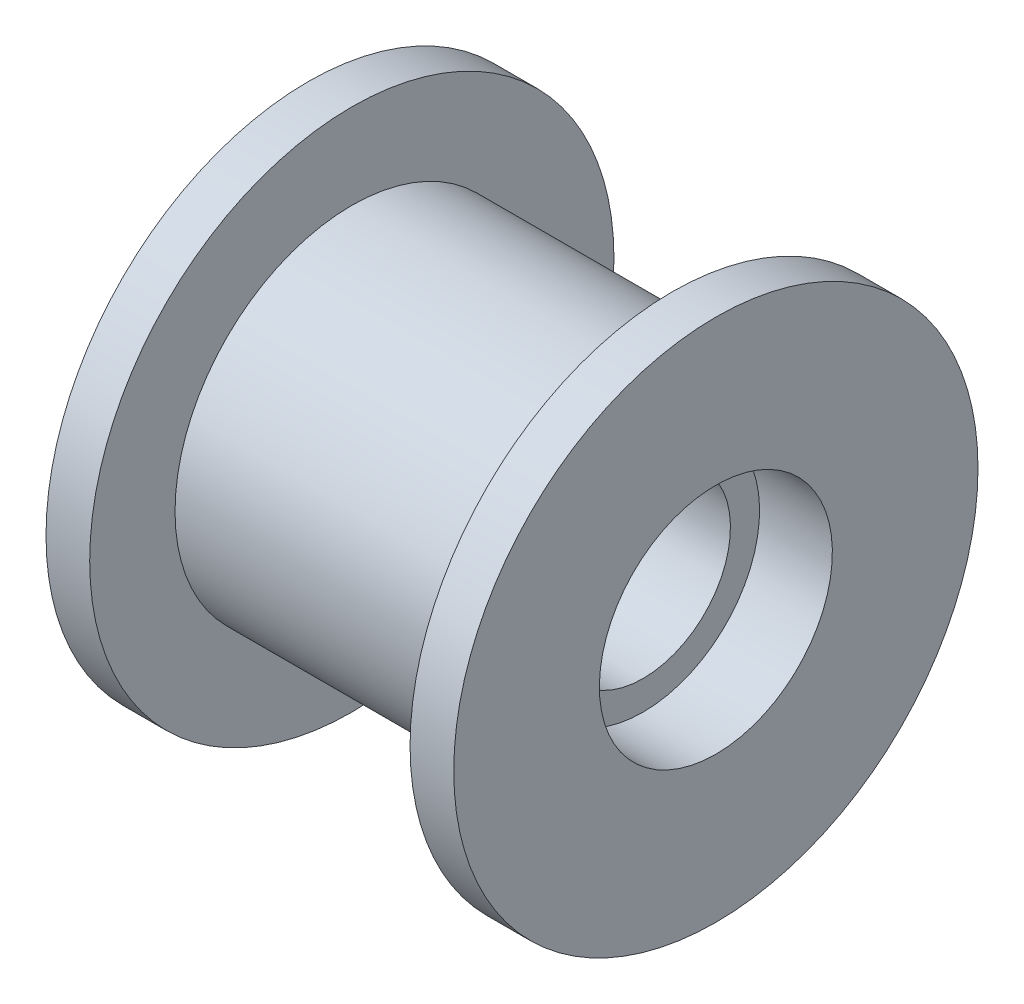
ISO-10303-21;
HEADER;
FILE_DESCRIPTION(('STEP AP214'),'2;1');
FILE_NAME('part.step','',(''),(''),'','','');
FILE_SCHEMA(('AUTOMOTIVE_DESIGN { 1 0 10303 214 1 1 1 1 }'));
ENDSEC;
DATA;
#1=APPLICATION_CONTEXT('core data for automotive mechanical design processes');
#2=APPLICATION_PROTOCOL_DEFINITION('international standard','automotive_design',2000,#1);
#3=PRODUCT_CONTEXT('',#1,'mechanical');
#4=PRODUCT('Part','Part','',(#3));
#5=PRODUCT_RELATED_PRODUCT_CATEGORY('part','',(#4));
#6=PRODUCT_DEFINITION_FORMATION('','',#4);
#7=PRODUCT_DEFINITION_CONTEXT('part definition',#1,'design');
#8=PRODUCT_DEFINITION('design','',#6,#7);
#9=PRODUCT_DEFINITION_SHAPE('','',#8);
#10=(LENGTH_UNIT() NAMED_UNIT(*) SI_UNIT(.MILLI.,.METRE.));
#11=(NAMED_UNIT(*) PLANE_ANGLE_UNIT() SI_UNIT($,.RADIAN.));
#12=(NAMED_UNIT(*) SI_UNIT($,.STERADIAN.) SOLID_ANGLE_UNIT());
#13=UNCERTAINTY_MEASURE_WITH_UNIT(LENGTH_MEASURE(1.E-05),#10,'distance_accuracy_value','');
#14=(GEOMETRIC_REPRESENTATION_CONTEXT(3) GLOBAL_UNCERTAINTY_ASSIGNED_CONTEXT((#13)) GLOBAL_UNIT_ASSIGNED_CONTEXT((#10,
#11,#12)) REPRESENTATION_CONTEXT('',''));
#15=CARTESIAN_POINT('',(0.,0.,0.));
#16=DIRECTION('',(0.,0.,1.));
#17=DIRECTION('',(1.,0.,0.));
#18=AXIS2_PLACEMENT_3D('',#15,#16,#17);
#19=CARTESIAN_POINT('',(-7.,0.,0.));
#20=DIRECTION('',(1.,0.,0.));
#21=DIRECTION('',(0.,1.,0.));
#22=AXIS2_PLACEMENT_3D('',#19,#20,#21);
#23=CYLINDRICAL_SURFACE('',#22,3.);
#24=CARTESIAN_POINT('',(4.5,0.,0.));
#25=DIRECTION('',(-1.,0.,0.));
#26=DIRECTION('',(0.,-1.,0.));
#27=AXIS2_PLACEMENT_3D('',#24,#25,#26);
#28=CIRCLE('',#27,3.);
#29=CARTESIAN_POINT('',(4.5,-3.,0.));
#30=VERTEX_POINT('',#29);
#31=EDGE_CURVE('E38',#30,#30,#28,.F.);
#32=ORIENTED_EDGE('',*,*,#31,.T.);
#33=EDGE_LOOP('',(#32));
#34=FACE_BOUND('',#33,.T.);
#35=CARTESIAN_POINT('',(-4.5,0.,0.));
#36=DIRECTION('',(-1.,0.,0.));
#37=DIRECTION('',(0.,-1.,0.));
#38=AXIS2_PLACEMENT_3D('',#35,#36,#37);
#39=CIRCLE('',#38,3.);
#40=CARTESIAN_POINT('',(-4.5,-3.,0.));
#41=VERTEX_POINT('',#40);
#42=EDGE_CURVE('E50',#41,#41,#39,.F.);
#43=ORIENTED_EDGE('',*,*,#42,.F.);
#44=EDGE_LOOP('',(#43));
#45=FACE_BOUND('',#44,.T.);
#46=ADVANCED_FACE('F34',(#34,#45),#23,.F.);
#47=CARTESIAN_POINT('',(-7.,0.,0.));
#48=DIRECTION('',(-1.,0.,0.));
#49=DIRECTION('',(0.,-1.,0.));
#50=AXIS2_PLACEMENT_3D('',#47,#48,#49);
#51=PLANE('',#50);
#52=CARTESIAN_POINT('',(-7.,0.,0.));
#53=DIRECTION('',(-1.,0.,0.));
#54=DIRECTION('',(0.,-1.,0.));
#55=AXIS2_PLACEMENT_3D('',#52,#53,#54);
#56=CIRCLE('',#55,4.);
#57=CARTESIAN_POINT('',(-7.,-4.,0.));
#58=VERTEX_POINT('',#57);
#59=EDGE_CURVE('E60',#58,#58,#56,.T.);
#60=ORIENTED_EDGE('',*,*,#59,.F.);
#61=EDGE_LOOP('',(#60));
#62=FACE_BOUND('',#61,.T.);
#63=CARTESIAN_POINT('',(-7.,0.,0.));
#64=DIRECTION('',(1.,0.,0.));
#65=DIRECTION('',(0.,1.,0.));
#66=AXIS2_PLACEMENT_3D('',#63,#64,#65);
#67=CIRCLE('',#66,9.);
#68=CARTESIAN_POINT('',(-7.,9.,0.));
#69=VERTEX_POINT('',#68);
#70=EDGE_CURVE('E10',#69,#69,#67,.T.);
#71=ORIENTED_EDGE('',*,*,#70,.F.);
#72=EDGE_LOOP('',(#71));
#73=FACE_BOUND('',#72,.T.);
#74=ADVANCED_FACE('F36',(#62,#73),#51,.T.);
#75=CARTESIAN_POINT('',(7.,0.,0.));
#76=DIRECTION('',(1.,0.,0.));
#77=DIRECTION('',(0.,1.,0.));
#78=AXIS2_PLACEMENT_3D('',#75,#76,#77);
#79=CYLINDRICAL_SURFACE('',#78,9.);
#80=ORIENTED_EDGE('',*,*,#70,.T.);
#81=EDGE_LOOP('',(#80));
#82=FACE_BOUND('',#81,.T.);
#83=CARTESIAN_POINT('',(-5.5,0.,0.));
#84=DIRECTION('',(1.,0.,0.));
#85=DIRECTION('',(0.,1.,0.));
#86=AXIS2_PLACEMENT_3D('',#83,#84,#85);
#87=CIRCLE('',#86,9.);
#88=CARTESIAN_POINT('',(-5.5,9.,0.));
#89=VERTEX_POINT('',#88);
#90=EDGE_CURVE('E42',#89,#89,#87,.T.);
#91=ORIENTED_EDGE('',*,*,#90,.F.);
#92=EDGE_LOOP('',(#91));
#93=FACE_BOUND('',#92,.T.);
#94=ADVANCED_FACE('F82',(#82,#93),#79,.T.);
#95=CARTESIAN_POINT('',(-5.5,9.,0.));
#96=DIRECTION('',(1.,0.,0.));
#97=DIRECTION('',(0.,1.,0.));
#98=AXIS2_PLACEMENT_3D('',#95,#96,#97);
#99=PLANE('',#98);
#100=ORIENTED_EDGE('',*,*,#90,.T.);
#101=EDGE_LOOP('',(#100));
#102=FACE_BOUND('',#101,.T.);
#103=CARTESIAN_POINT('',(-5.5,0.,0.));
#104=DIRECTION('',(1.,0.,0.));
#105=DIRECTION('',(0.,1.,0.));
#106=AXIS2_PLACEMENT_3D('',#103,#104,#105);
#107=CIRCLE('',#106,6.07);
#108=CARTESIAN_POINT('',(-5.5,6.07,0.));
#109=VERTEX_POINT('',#108);
#110=EDGE_CURVE('E47',#109,#109,#107,.T.);
#111=ORIENTED_EDGE('',*,*,#110,.F.);
#112=EDGE_LOOP('',(#111));
#113=FACE_BOUND('',#112,.T.);
#114=ADVANCED_FACE('F80',(#102,#113),#99,.T.);
#115=CARTESIAN_POINT('',(7.,0.,0.));
#116=DIRECTION('',(1.,0.,0.));
#117=DIRECTION('',(0.,1.,0.));
#118=AXIS2_PLACEMENT_3D('',#115,#116,#117);
#119=CYLINDRICAL_SURFACE('',#118,6.07);
#120=ORIENTED_EDGE('',*,*,#110,.T.);
#121=EDGE_LOOP('',(#120));
#122=FACE_BOUND('',#121,.T.);
#123=CARTESIAN_POINT('',(5.5,0.,0.));
#124=DIRECTION('',(1.,0.,0.));
#125=DIRECTION('',(0.,1.,0.));
#126=AXIS2_PLACEMENT_3D('',#123,#124,#125);
#127=CIRCLE('',#126,6.07);
#128=CARTESIAN_POINT('',(5.5,6.07,0.));
#129=VERTEX_POINT('',#128);
#130=EDGE_CURVE('E72',#129,#129,#127,.T.);
#131=ORIENTED_EDGE('',*,*,#130,.F.);
#132=EDGE_LOOP('',(#131));
#133=FACE_BOUND('',#132,.T.);
#134=ADVANCED_FACE('F77',(#122,#133),#119,.T.);
#135=CARTESIAN_POINT('',(5.5,6.07,0.));
#136=DIRECTION('',(-1.,0.,0.));
#137=DIRECTION('',(0.,-1.,0.));
#138=AXIS2_PLACEMENT_3D('',#135,#136,#137);
#139=PLANE('',#138);
#140=ORIENTED_EDGE('',*,*,#130,.T.);
#141=EDGE_LOOP('',(#140));
#142=FACE_BOUND('',#141,.T.);
#143=CARTESIAN_POINT('',(5.5,0.,0.));
#144=DIRECTION('',(1.,0.,0.));
#145=DIRECTION('',(0.,1.,0.));
#146=AXIS2_PLACEMENT_3D('',#143,#144,#145);
#147=CIRCLE('',#146,9.);
#148=CARTESIAN_POINT('',(5.5,9.,0.));
#149=VERTEX_POINT('',#148);
#150=EDGE_CURVE('E57',#149,#149,#147,.T.);
#151=ORIENTED_EDGE('',*,*,#150,.F.);
#152=EDGE_LOOP('',(#151));
#153=FACE_BOUND('',#152,.T.);
#154=ADVANCED_FACE('F89',(#142,#153),#139,.T.);
#155=CARTESIAN_POINT('',(7.,0.,0.));
#156=DIRECTION('',(1.,0.,0.));
#157=DIRECTION('',(0.,1.,0.));
#158=AXIS2_PLACEMENT_3D('',#155,#156,#157);
#159=CYLINDRICAL_SURFACE('',#158,9.);
#160=ORIENTED_EDGE('',*,*,#150,.T.);
#161=EDGE_LOOP('',(#160));
#162=FACE_BOUND('',#161,.T.);
#163=CARTESIAN_POINT('',(7.,0.,0.));
#164=DIRECTION('',(1.,0.,0.));
#165=DIRECTION('',(0.,1.,0.));
#166=AXIS2_PLACEMENT_3D('',#163,#164,#165);
#167=CIRCLE('',#166,9.);
#168=CARTESIAN_POINT('',(7.,9.,0.));
#169=VERTEX_POINT('',#168);
#170=EDGE_CURVE('E52',#169,#169,#167,.T.);
#171=ORIENTED_EDGE('',*,*,#170,.F.);
#172=EDGE_LOOP('',(#171));
#173=FACE_BOUND('',#172,.T.);
#174=ADVANCED_FACE('F108',(#162,#173),#159,.T.);
#175=CARTESIAN_POINT('',(7.,9.,0.));
#176=DIRECTION('',(1.,0.,0.));
#177=DIRECTION('',(0.,1.,0.));
#178=AXIS2_PLACEMENT_3D('',#175,#176,#177);
#179=PLANE('',#178);
#180=CARTESIAN_POINT('',(7.,0.,0.));
#181=DIRECTION('',(-1.,0.,0.));
#182=DIRECTION('',(0.,-1.,0.));
#183=AXIS2_PLACEMENT_3D('',#180,#181,#182);
#184=CIRCLE('',#183,4.);
#185=CARTESIAN_POINT('',(7.,-4.,0.));
#186=VERTEX_POINT('',#185);
#187=EDGE_CURVE('E67',#186,#186,#184,.T.);
#188=ORIENTED_EDGE('',*,*,#187,.T.);
#189=EDGE_LOOP('',(#188));
#190=FACE_BOUND('',#189,.T.);
#191=ORIENTED_EDGE('',*,*,#170,.T.);
#192=EDGE_LOOP('',(#191));
#193=FACE_BOUND('',#192,.T.);
#194=ADVANCED_FACE('F104',(#190,#193),#179,.T.);
#195=CARTESIAN_POINT('',(-4.5,0.,0.));
#196=DIRECTION('',(-1.,0.,0.));
#197=DIRECTION('',(0.,-1.,0.));
#198=AXIS2_PLACEMENT_3D('',#195,#196,#197);
#199=PLANE('',#198);
#200=CARTESIAN_POINT('',(-4.5,0.,0.));
#201=DIRECTION('',(-1.,0.,0.));
#202=DIRECTION('',(0.,-1.,0.));
#203=AXIS2_PLACEMENT_3D('',#200,#201,#202);
#204=CIRCLE('',#203,4.);
#205=CARTESIAN_POINT('',(-4.5,-4.,0.));
#206=VERTEX_POINT('',#205);
#207=EDGE_CURVE('E53',#206,#206,#204,.T.);
#208=ORIENTED_EDGE('',*,*,#207,.T.);
#209=EDGE_LOOP('',(#208));
#210=FACE_BOUND('',#209,.T.);
#211=ORIENTED_EDGE('',*,*,#42,.T.);
#212=EDGE_LOOP('',(#211));
#213=FACE_BOUND('',#212,.T.);
#214=ADVANCED_FACE('F107',(#210,#213),#199,.T.);
#215=CARTESIAN_POINT('',(-4.5,0.,0.));
#216=DIRECTION('',(-1.,0.,0.));
#217=DIRECTION('',(0.,-1.,0.));
#218=AXIS2_PLACEMENT_3D('',#215,#216,#217);
#219=CYLINDRICAL_SURFACE('',#218,4.);
#220=ORIENTED_EDGE('',*,*,#207,.F.);
#221=EDGE_LOOP('',(#220));
#222=FACE_BOUND('',#221,.T.);
#223=ORIENTED_EDGE('',*,*,#59,.T.);
#224=EDGE_LOOP('',(#223));
#225=FACE_BOUND('',#224,.T.);
#226=ADVANCED_FACE('F102',(#222,#225),#219,.F.);
#227=CARTESIAN_POINT('',(4.5,0.,0.));
#228=DIRECTION('',(-1.,0.,0.));
#229=DIRECTION('',(0.,-1.,0.));
#230=AXIS2_PLACEMENT_3D('',#227,#228,#229);
#231=PLANE('',#230);
#232=CARTESIAN_POINT('',(4.5,0.,0.));
#233=DIRECTION('',(-1.,0.,0.));
#234=DIRECTION('',(0.,-1.,0.));
#235=AXIS2_PLACEMENT_3D('',#232,#233,#234);
#236=CIRCLE('',#235,4.);
#237=CARTESIAN_POINT('',(4.5,-4.,0.));
#238=VERTEX_POINT('',#237);
#239=EDGE_CURVE('E203',#238,#238,#236,.T.);
#240=ORIENTED_EDGE('',*,*,#239,.F.);
#241=EDGE_LOOP('',(#240));
#242=FACE_BOUND('',#241,.T.);
#243=ORIENTED_EDGE('',*,*,#31,.F.);
#244=EDGE_LOOP('',(#243));
#245=FACE_BOUND('',#244,.T.);
#246=ADVANCED_FACE('F146',(#242,#245),#231,.F.);
#247=CARTESIAN_POINT('',(4.5,0.,0.));
#248=DIRECTION('',(1.,0.,0.));
#249=DIRECTION('',(0.,1.,0.));
#250=AXIS2_PLACEMENT_3D('',#247,#248,#249);
#251=CYLINDRICAL_SURFACE('',#250,4.);
#252=ORIENTED_EDGE('',*,*,#239,.T.);
#253=EDGE_LOOP('',(#252));
#254=FACE_BOUND('',#253,.T.);
#255=ORIENTED_EDGE('',*,*,#187,.F.);
#256=EDGE_LOOP('',(#255));
#257=FACE_BOUND('',#256,.T.);
#258=ADVANCED_FACE('F152',(#254,#257),#251,.F.);
#259=CLOSED_SHELL('',(#46,#74,#94,#114,#134,#154,#174,#194,#214,#226,#246,#258));
#260=MANIFOLD_SOLID_BREP('B2',#259);
#261=ADVANCED_BREP_SHAPE_REPRESENTATION('',(#18,#260),#14);
#262=SHAPE_DEFINITION_REPRESENTATION(#9,#261);
ENDSEC;
END-ISO-10303-21;
